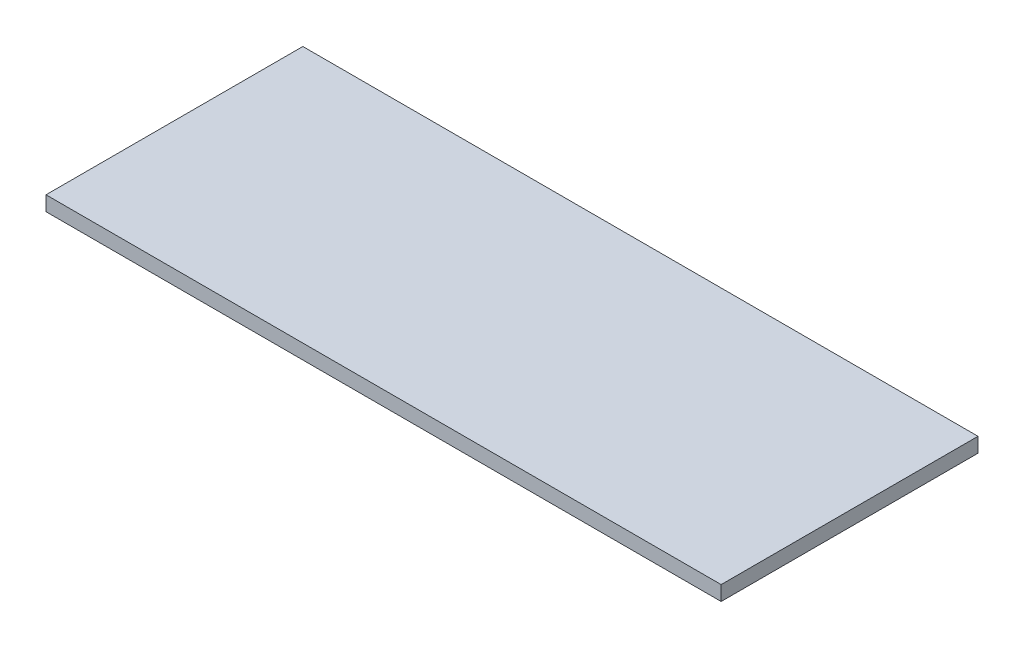
ISO-10303-21;
HEADER;
FILE_DESCRIPTION(('STEP AP214'),'2;1');
FILE_NAME('part.step','',(''),(''),'','','');
FILE_SCHEMA(('AUTOMOTIVE_DESIGN { 1 0 10303 214 1 1 1 1 }'));
ENDSEC;
DATA;
#1=APPLICATION_CONTEXT('core data for automotive mechanical design processes');
#2=APPLICATION_PROTOCOL_DEFINITION('international standard','automotive_design',2000,#1);
#3=PRODUCT_CONTEXT('',#1,'mechanical');
#4=PRODUCT('Part','Part','',(#3));
#5=PRODUCT_RELATED_PRODUCT_CATEGORY('part','',(#4));
#6=PRODUCT_DEFINITION_FORMATION('','',#4);
#7=PRODUCT_DEFINITION_CONTEXT('part definition',#1,'design');
#8=PRODUCT_DEFINITION('design','',#6,#7);
#9=PRODUCT_DEFINITION_SHAPE('','',#8);
#10=(LENGTH_UNIT() NAMED_UNIT(*) SI_UNIT(.MILLI.,.METRE.));
#11=(NAMED_UNIT(*) PLANE_ANGLE_UNIT() SI_UNIT($,.RADIAN.));
#12=(NAMED_UNIT(*) SI_UNIT($,.STERADIAN.) SOLID_ANGLE_UNIT());
#13=UNCERTAINTY_MEASURE_WITH_UNIT(LENGTH_MEASURE(1.E-05),#10,'distance_accuracy_value','');
#14=(GEOMETRIC_REPRESENTATION_CONTEXT(3) GLOBAL_UNCERTAINTY_ASSIGNED_CONTEXT((#13)) GLOBAL_UNIT_ASSIGNED_CONTEXT((#10,
#11,#12)) REPRESENTATION_CONTEXT('',''));
#15=CARTESIAN_POINT('',(0.,0.,0.));
#16=DIRECTION('',(0.,0.,1.));
#17=DIRECTION('',(1.,0.,0.));
#18=AXIS2_PLACEMENT_3D('',#15,#16,#17);
#19=CARTESIAN_POINT('',(0.,10.,0.));
#20=DIRECTION('',(1.,0.,0.));
#21=DIRECTION('',(0.,0.,-1.));
#22=AXIS2_PLACEMENT_3D('',#19,#20,#21);
#23=PLANE('',#22);
#24=DIRECTION('',(0.,0.,1.));
#25=VECTOR('',#24,1.);
#26=CARTESIAN_POINT('',(0.,0.,0.));
#27=LINE('',#26,#25);
#28=CARTESIAN_POINT('',(0.,0.,-175.));
#29=VERTEX_POINT('',#28);
#30=CARTESIAN_POINT('',(0.,0.,0.));
#31=VERTEX_POINT('',#30);
#32=EDGE_CURVE('E107',#29,#31,#27,.T.);
#33=ORIENTED_EDGE('',*,*,#32,.T.);
#34=DIRECTION('',(0.,-1.,0.));
#35=VECTOR('',#34,1.);
#36=CARTESIAN_POINT('',(0.,10.,0.));
#37=LINE('',#36,#35);
#38=CARTESIAN_POINT('',(0.,10.,0.));
#39=VERTEX_POINT('',#38);
#40=EDGE_CURVE('E11',#39,#31,#37,.T.);
#41=ORIENTED_EDGE('',*,*,#40,.F.);
#42=DIRECTION('',(0.,0.,1.));
#43=VECTOR('',#42,1.);
#44=CARTESIAN_POINT('',(0.,10.,0.));
#45=LINE('',#44,#43);
#46=CARTESIAN_POINT('',(0.,10.,-175.));
#47=VERTEX_POINT('',#46);
#48=EDGE_CURVE('E91',#47,#39,#45,.T.);
#49=ORIENTED_EDGE('',*,*,#48,.F.);
#50=DIRECTION('',(0.,-1.,0.));
#51=VECTOR('',#50,1.);
#52=CARTESIAN_POINT('',(0.,10.,-175.));
#53=LINE('',#52,#51);
#54=EDGE_CURVE('E103',#47,#29,#53,.T.);
#55=ORIENTED_EDGE('',*,*,#54,.T.);
#56=EDGE_LOOP('',(#33,#41,#49,#55));
#57=FACE_BOUND('',#56,.T.);
#58=ADVANCED_FACE('F39',(#57),#23,.F.);
#59=CARTESIAN_POINT('',(0.,10.,0.));
#60=DIRECTION('',(0.,0.,-1.));
#61=DIRECTION('',(-1.,0.,0.));
#62=AXIS2_PLACEMENT_3D('',#59,#60,#61);
#63=PLANE('',#62);
#64=DIRECTION('',(1.,0.,0.));
#65=VECTOR('',#64,1.);
#66=CARTESIAN_POINT('',(0.,0.,0.));
#67=LINE('',#66,#65);
#68=CARTESIAN_POINT('',(460.,0.,0.));
#69=VERTEX_POINT('',#68);
#70=EDGE_CURVE('E96',#31,#69,#67,.T.);
#71=ORIENTED_EDGE('',*,*,#70,.T.);
#72=DIRECTION('',(0.,-1.,0.));
#73=VECTOR('',#72,1.);
#74=CARTESIAN_POINT('',(460.,10.,0.));
#75=LINE('',#74,#73);
#76=CARTESIAN_POINT('',(460.,10.,0.));
#77=VERTEX_POINT('',#76);
#78=EDGE_CURVE('E48',#77,#69,#75,.T.);
#79=ORIENTED_EDGE('',*,*,#78,.F.);
#80=DIRECTION('',(1.,0.,0.));
#81=VECTOR('',#80,1.);
#82=CARTESIAN_POINT('',(0.,10.,0.));
#83=LINE('',#82,#81);
#84=EDGE_CURVE('E86',#39,#77,#83,.T.);
#85=ORIENTED_EDGE('',*,*,#84,.F.);
#86=ORIENTED_EDGE('',*,*,#40,.T.);
#87=EDGE_LOOP('',(#71,#79,#85,#86));
#88=FACE_BOUND('',#87,.T.);
#89=ADVANCED_FACE('F95',(#88),#63,.F.);
#90=CARTESIAN_POINT('',(460.,10.,0.));
#91=DIRECTION('',(-1.,0.,0.));
#92=DIRECTION('',(0.,0.,1.));
#93=AXIS2_PLACEMENT_3D('',#90,#91,#92);
#94=PLANE('',#93);
#95=DIRECTION('',(0.,0.,-1.));
#96=VECTOR('',#95,1.);
#97=CARTESIAN_POINT('',(460.,0.,0.));
#98=LINE('',#97,#96);
#99=CARTESIAN_POINT('',(460.,0.,-175.));
#100=VERTEX_POINT('',#99);
#101=EDGE_CURVE('E73',#69,#100,#98,.T.);
#102=ORIENTED_EDGE('',*,*,#101,.T.);
#103=DIRECTION('',(0.,-1.,0.));
#104=VECTOR('',#103,1.);
#105=CARTESIAN_POINT('',(460.,10.,-175.));
#106=LINE('',#105,#104);
#107=CARTESIAN_POINT('',(460.,10.,-175.));
#108=VERTEX_POINT('',#107);
#109=EDGE_CURVE('E98',#108,#100,#106,.T.);
#110=ORIENTED_EDGE('',*,*,#109,.F.);
#111=DIRECTION('',(0.,0.,-1.));
#112=VECTOR('',#111,1.);
#113=CARTESIAN_POINT('',(460.,10.,0.));
#114=LINE('',#113,#112);
#115=EDGE_CURVE('E89',#77,#108,#114,.T.);
#116=ORIENTED_EDGE('',*,*,#115,.F.);
#117=ORIENTED_EDGE('',*,*,#78,.T.);
#118=EDGE_LOOP('',(#102,#110,#116,#117));
#119=FACE_BOUND('',#118,.T.);
#120=ADVANCED_FACE('F99',(#119),#94,.F.);
#121=CARTESIAN_POINT('',(0.,10.,-175.));
#122=DIRECTION('',(0.,0.,1.));
#123=DIRECTION('',(1.,0.,0.));
#124=AXIS2_PLACEMENT_3D('',#121,#122,#123);
#125=PLANE('',#124);
#126=DIRECTION('',(-1.,0.,0.));
#127=VECTOR('',#126,1.);
#128=CARTESIAN_POINT('',(0.,0.,-175.));
#129=LINE('',#128,#127);
#130=EDGE_CURVE('E79',#100,#29,#129,.T.);
#131=ORIENTED_EDGE('',*,*,#130,.T.);
#132=ORIENTED_EDGE('',*,*,#54,.F.);
#133=DIRECTION('',(-1.,0.,0.));
#134=VECTOR('',#133,1.);
#135=CARTESIAN_POINT('',(0.,10.,-175.));
#136=LINE('',#135,#134);
#137=EDGE_CURVE('E56',#108,#47,#136,.T.);
#138=ORIENTED_EDGE('',*,*,#137,.F.);
#139=ORIENTED_EDGE('',*,*,#109,.T.);
#140=EDGE_LOOP('',(#131,#132,#138,#139));
#141=FACE_BOUND('',#140,.T.);
#142=ADVANCED_FACE('F120',(#141),#125,.F.);
#143=CARTESIAN_POINT('',(0.,10.,0.));
#144=DIRECTION('',(0.,-1.,0.));
#145=DIRECTION('',(0.,0.,-1.));
#146=AXIS2_PLACEMENT_3D('',#143,#144,#145);
#147=PLANE('',#146);
#148=ORIENTED_EDGE('',*,*,#48,.T.);
#149=ORIENTED_EDGE('',*,*,#84,.T.);
#150=ORIENTED_EDGE('',*,*,#115,.T.);
#151=ORIENTED_EDGE('',*,*,#137,.T.);
#152=EDGE_LOOP('',(#148,#149,#150,#151));
#153=FACE_BOUND('',#152,.T.);
#154=ADVANCED_FACE('F87',(#153),#147,.F.);
#155=CARTESIAN_POINT('',(0.,0.,0.));
#156=DIRECTION('',(0.,-1.,0.));
#157=DIRECTION('',(0.,0.,-1.));
#158=AXIS2_PLACEMENT_3D('',#155,#156,#157);
#159=PLANE('',#158);
#160=ORIENTED_EDGE('',*,*,#32,.F.);
#161=ORIENTED_EDGE('',*,*,#130,.F.);
#162=ORIENTED_EDGE('',*,*,#101,.F.);
#163=ORIENTED_EDGE('',*,*,#70,.F.);
#164=EDGE_LOOP('',(#160,#161,#162,#163));
#165=FACE_BOUND('',#164,.T.);
#166=ADVANCED_FACE('F123',(#165),#159,.T.);
#167=CLOSED_SHELL('',(#58,#89,#120,#142,#154,#166));
#168=MANIFOLD_SOLID_BREP('B2',#167);
#169=ADVANCED_BREP_SHAPE_REPRESENTATION('',(#18,#168),#14);
#170=SHAPE_DEFINITION_REPRESENTATION(#9,#169);
ENDSEC;
END-ISO-10303-21;
